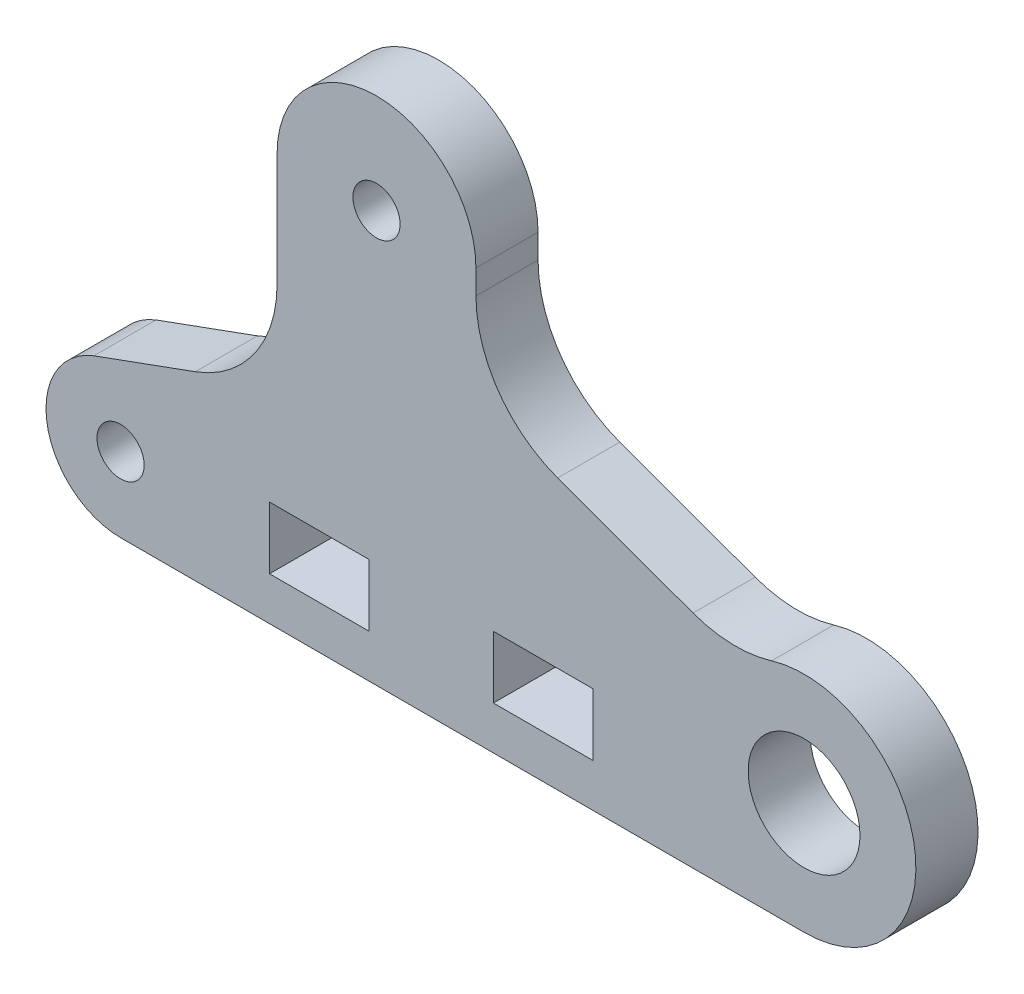
ISO-10303-21;
HEADER;
FILE_DESCRIPTION(('STEP AP214'),'2;1');
FILE_NAME('part.step','',(''),(''),'','','');
FILE_SCHEMA(('AUTOMOTIVE_DESIGN { 1 0 10303 214 1 1 1 1 }'));
ENDSEC;
DATA;
#1=APPLICATION_CONTEXT('core data for automotive mechanical design processes');
#2=APPLICATION_PROTOCOL_DEFINITION('international standard','automotive_design',2000,#1);
#3=PRODUCT_CONTEXT('',#1,'mechanical');
#4=PRODUCT('Part','Part','',(#3));
#5=PRODUCT_RELATED_PRODUCT_CATEGORY('part','',(#4));
#6=PRODUCT_DEFINITION_FORMATION('','',#4);
#7=PRODUCT_DEFINITION_CONTEXT('part definition',#1,'design');
#8=PRODUCT_DEFINITION('design','',#6,#7);
#9=PRODUCT_DEFINITION_SHAPE('','',#8);
#10=(LENGTH_UNIT() NAMED_UNIT(*) SI_UNIT(.MILLI.,.METRE.));
#11=(NAMED_UNIT(*) PLANE_ANGLE_UNIT() SI_UNIT($,.RADIAN.));
#12=(NAMED_UNIT(*) SI_UNIT($,.STERADIAN.) SOLID_ANGLE_UNIT());
#13=UNCERTAINTY_MEASURE_WITH_UNIT(LENGTH_MEASURE(1.E-05),#10,'distance_accuracy_value','');
#14=(GEOMETRIC_REPRESENTATION_CONTEXT(3) GLOBAL_UNCERTAINTY_ASSIGNED_CONTEXT((#13)) GLOBAL_UNIT_ASSIGNED_CONTEXT((#10,
#11,#12)) REPRESENTATION_CONTEXT('',''));
#15=CARTESIAN_POINT('',(0.,0.,0.));
#16=DIRECTION('',(0.,0.,1.));
#17=DIRECTION('',(1.,0.,0.));
#18=AXIS2_PLACEMENT_3D('',#15,#16,#17);
#19=CARTESIAN_POINT('',(-26.4043871462343,3.42677758397469,5.));
#20=DIRECTION('',(0.,0.,1.));
#21=DIRECTION('',(1.,0.,0.));
#22=AXIS2_PLACEMENT_3D('',#19,#20,#21);
#23=PLANE('',#22);
#24=CARTESIAN_POINT('',(-28.9999999999999,-14.5447928570877,5.));
#25=DIRECTION('',(0.,0.,1.));
#26=DIRECTION('',(1.,0.,0.));
#27=AXIS2_PLACEMENT_3D('',#24,#25,#26);
#28=CIRCLE('',#27,1.90000000000001);
#29=CARTESIAN_POINT('',(-27.0999999999999,-14.5447928570877,5.));
#30=VERTEX_POINT('',#29);
#31=EDGE_CURVE('E236',#30,#30,#28,.T.);
#32=ORIENTED_EDGE('',*,*,#31,.F.);
#33=EDGE_LOOP('',(#32));
#34=FACE_BOUND('',#33,.T.);
#35=CARTESIAN_POINT('',(-26.4043871462343,3.42677758397469,5.));
#36=DIRECTION('',(0.,0.,-1.));
#37=DIRECTION('',(1.,0.,0.));
#38=AXIS2_PLACEMENT_3D('',#35,#36,#37);
#39=CIRCLE('',#38,10.);
#40=CARTESIAN_POINT('',(-16.4043871462343,3.4267775839747,5.));
#41=VERTEX_POINT('',#40);
#42=CARTESIAN_POINT('',(-22.9841848611831,-5.97014831385656,5.));
#43=VERTEX_POINT('',#42);
#44=EDGE_CURVE('E248',#41,#43,#39,.T.);
#45=ORIENTED_EDGE('',*,*,#44,.T.);
#46=DIRECTION('',(-0.939659792499098,-0.342110324837693,0.));
#47=VECTOR('',#46,1.);
#48=CARTESIAN_POINT('',(-22.9841848611831,-5.97014831385656,5.));
#49=LINE('',#48,#47);
#50=CARTESIAN_POINT('',(-31.1458015519959,-8.94162092509676,5.));
#51=VERTEX_POINT('',#50);
#52=EDGE_CURVE('E251',#43,#51,#49,.T.);
#53=ORIENTED_EDGE('',*,*,#52,.T.);
#54=CARTESIAN_POINT('',(-28.9999999999999,-14.5447928570877,5.));
#55=DIRECTION('',(0.,0.,1.));
#56=DIRECTION('',(1.,0.,0.));
#57=AXIS2_PLACEMENT_3D('',#54,#55,#56);
#58=CIRCLE('',#57,6.00000000000003);
#59=CARTESIAN_POINT('',(-28.9999999999999,-20.5447928570877,5.));
#60=VERTEX_POINT('',#59);
#61=EDGE_CURVE('E254',#51,#60,#58,.T.);
#62=ORIENTED_EDGE('',*,*,#61,.T.);
#63=DIRECTION('',(1.,0.,0.));
#64=VECTOR('',#63,1.);
#65=CARTESIAN_POINT('',(-28.9999999999999,-20.5447928570878,5.));
#66=LINE('',#65,#64);
#67=CARTESIAN_POINT('',(26.,-20.5447928570878,5.));
#68=VERTEX_POINT('',#67);
#69=EDGE_CURVE('E256',#60,#68,#66,.T.);
#70=ORIENTED_EDGE('',*,*,#69,.T.);
#71=CARTESIAN_POINT('',(26.,-11.5447928570875,5.));
#72=DIRECTION('',(0.,0.,1.));
#73=DIRECTION('',(1.,0.,0.));
#74=AXIS2_PLACEMENT_3D('',#71,#72,#73);
#75=CIRCLE('',#74,9.00000000072732);
#76=CARTESIAN_POINT('',(23.3882644662946,-2.93207914333433,5.));
#77=VERTEX_POINT('',#76);
#78=EDGE_CURVE('E258',#68,#77,#75,.T.);
#79=ORIENTED_EDGE('',*,*,#78,.T.);
#80=CARTESIAN_POINT('',(20.4863360951547,6.63760276201075,5.));
#81=DIRECTION('',(0.,0.,-1.));
#82=DIRECTION('',(1.,0.,0.));
#83=AXIS2_PLACEMENT_3D('',#80,#81,#82);
#84=CIRCLE('',#83,10.0000000006543);
#85=CARTESIAN_POINT('',(17.0661345345524,-2.75932340019466,5.));
#86=VERTEX_POINT('',#85);
#87=EDGE_CURVE('E260',#77,#86,#84,.T.);
#88=ORIENTED_EDGE('',*,*,#87,.T.);
#89=DIRECTION('',(-0.939692607789412,0.342020179033247,0.));
#90=VECTOR('',#89,1.);
#91=CARTESIAN_POINT('',(17.0661345347762,-2.75932339957974,5.));
#92=LINE('',#91,#90);
#93=CARTESIAN_POINT('',(6.17541319131859,1.20457546778829,5.));
#94=VERTEX_POINT('',#93);
#95=EDGE_CURVE('E262',#86,#94,#92,.T.);
#96=ORIENTED_EDGE('',*,*,#95,.T.);
#97=CARTESIAN_POINT('',(9.59561413690513,10.6015018531449,5.));
#98=DIRECTION('',(0.,0.,-1.));
#99=DIRECTION('',(1.,0.,0.));
#100=AXIS2_PLACEMENT_3D('',#97,#98,#99);
#101=CIRCLE('',#100,10.0000002615902);
#102=CARTESIAN_POINT('',(-0.404386124685043,10.6015018531449,5.));
#103=VERTEX_POINT('',#102);
#104=EDGE_CURVE('E264',#94,#103,#101,.T.);
#105=ORIENTED_EDGE('',*,*,#104,.T.);
#106=DIRECTION('',(0.,1.,0.));
#107=VECTOR('',#106,1.);
#108=CARTESIAN_POINT('',(-0.404386386275102,10.6015018531449,5.));
#109=LINE('',#108,#107);
#110=CARTESIAN_POINT('',(-0.404386386275102,12.5454174696564,5.));
#111=VERTEX_POINT('',#110);
#112=EDGE_CURVE('E266',#103,#111,#109,.T.);
#113=ORIENTED_EDGE('',*,*,#112,.T.);
#114=CARTESIAN_POINT('',(-8.40438638627509,12.5454174696564,5.));
#115=DIRECTION('',(0.,0.,1.));
#116=DIRECTION('',(1.,0.,0.));
#117=AXIS2_PLACEMENT_3D('',#114,#115,#116);
#118=CIRCLE('',#117,8.0000003799796);
#119=CARTESIAN_POINT('',(-16.4043867662547,12.5454174696564,5.));
#120=VERTEX_POINT('',#119);
#121=EDGE_CURVE('E268',#111,#120,#118,.T.);
#122=ORIENTED_EDGE('',*,*,#121,.T.);
#123=DIRECTION('',(0.,-1.,0.));
#124=VECTOR('',#123,1.);
#125=CARTESIAN_POINT('',(-16.4043871462343,12.5454174696564,5.));
#126=LINE('',#125,#124);
#127=EDGE_CURVE('E270',#120,#41,#126,.T.);
#128=ORIENTED_EDGE('',*,*,#127,.T.);
#129=EDGE_LOOP('',(#45,#53,#62,#70,#79,#88,#96,#105,#113,#122,#128));
#130=FACE_BOUND('',#129,.T.);
#131=CARTESIAN_POINT('',(-8.40438638627509,12.5454174696564,5.));
#132=DIRECTION('',(0.,0.,1.));
#133=DIRECTION('',(1.,0.,0.));
#134=AXIS2_PLACEMENT_3D('',#131,#132,#133);
#135=CIRCLE('',#134,1.90000000000002);
#136=CARTESIAN_POINT('',(-6.50438638627507,12.5454174696564,5.));
#137=VERTEX_POINT('',#136);
#138=EDGE_CURVE('E242',#137,#137,#135,.T.);
#139=ORIENTED_EDGE('',*,*,#138,.F.);
#140=EDGE_LOOP('',(#139));
#141=FACE_BOUND('',#140,.T.);
#142=CARTESIAN_POINT('',(26.,-11.5447928570875,5.));
#143=DIRECTION('',(0.,0.,1.));
#144=DIRECTION('',(1.,0.,0.));
#145=AXIS2_PLACEMENT_3D('',#142,#143,#144);
#146=CIRCLE('',#145,4.5);
#147=CARTESIAN_POINT('',(30.5,-11.5447928570875,5.));
#148=VERTEX_POINT('',#147);
#149=EDGE_CURVE('E230',#148,#148,#146,.T.);
#150=ORIENTED_EDGE('',*,*,#149,.F.);
#151=EDGE_LOOP('',(#150));
#152=FACE_BOUND('',#151,.T.);
#153=DIRECTION('',(1.,0.,0.));
#154=VECTOR('',#153,1.);
#155=CARTESIAN_POINT('',(0.999995852421655,-17.0647928570878,5.));
#156=LINE('',#155,#154);
#157=CARTESIAN_POINT('',(0.999995852421655,-17.0647928570878,5.));
#158=VERTEX_POINT('',#157);
#159=CARTESIAN_POINT('',(8.99999585242166,-17.0647928570878,5.));
#160=VERTEX_POINT('',#159);
#161=EDGE_CURVE('E201',#158,#160,#156,.T.);
#162=ORIENTED_EDGE('',*,*,#161,.F.);
#163=DIRECTION('',(0.,-1.,0.));
#164=VECTOR('',#163,1.);
#165=CARTESIAN_POINT('',(0.999995852421655,-17.0647928570878,5.));
#166=LINE('',#165,#164);
#167=CARTESIAN_POINT('',(0.999995852421656,-12.0647928570878,5.));
#168=VERTEX_POINT('',#167);
#169=EDGE_CURVE('E199',#168,#158,#166,.T.);
#170=ORIENTED_EDGE('',*,*,#169,.F.);
#171=DIRECTION('',(-1.,0.,0.));
#172=VECTOR('',#171,1.);
#173=CARTESIAN_POINT('',(8.99999585242166,-12.0647928570878,5.));
#174=LINE('',#173,#172);
#175=CARTESIAN_POINT('',(8.99999585242165,-12.0647928570878,5.));
#176=VERTEX_POINT('',#175);
#177=EDGE_CURVE('E207',#176,#168,#174,.T.);
#178=ORIENTED_EDGE('',*,*,#177,.F.);
#179=DIRECTION('',(0.,1.,0.));
#180=VECTOR('',#179,1.);
#181=CARTESIAN_POINT('',(8.99999585242166,-17.0647928570878,5.));
#182=LINE('',#181,#180);
#183=EDGE_CURVE('E204',#160,#176,#182,.T.);
#184=ORIENTED_EDGE('',*,*,#183,.F.);
#185=EDGE_LOOP('',(#162,#170,#178,#184));
#186=FACE_BOUND('',#185,.T.);
#187=DIRECTION('',(-0.00277073646540046,-0.999996161502353,0.));
#188=VECTOR('',#187,1.);
#189=CARTESIAN_POINT('',(-17.0000041475783,-12.0647928570878,5.));
#190=LINE('',#189,#188);
#191=CARTESIAN_POINT('',(-17.0000041475783,-12.0647928570878,5.));
#192=VERTEX_POINT('',#191);
#193=CARTESIAN_POINT('',(-17.0138578830829,-17.0647928570878,5.));
#194=VERTEX_POINT('',#193);
#195=EDGE_CURVE('E171',#192,#194,#190,.T.);
#196=ORIENTED_EDGE('',*,*,#195,.F.);
#197=DIRECTION('',(-1.,0.,0.));
#198=VECTOR('',#197,1.);
#199=CARTESIAN_POINT('',(-9.00000414757835,-12.0647928570878,5.));
#200=LINE('',#199,#198);
#201=CARTESIAN_POINT('',(-9.00000414757835,-12.0647928570878,5.));
#202=VERTEX_POINT('',#201);
#203=EDGE_CURVE('E163',#202,#192,#200,.T.);
#204=ORIENTED_EDGE('',*,*,#203,.F.);
#205=DIRECTION('',(0.,1.,0.));
#206=VECTOR('',#205,1.);
#207=CARTESIAN_POINT('',(-9.00000414757835,-12.0647928570878,5.));
#208=LINE('',#207,#206);
#209=CARTESIAN_POINT('',(-9.00000414757834,-17.0647928570878,5.));
#210=VERTEX_POINT('',#209);
#211=EDGE_CURVE('E185',#210,#202,#208,.T.);
#212=ORIENTED_EDGE('',*,*,#211,.F.);
#213=DIRECTION('',(1.,0.,0.));
#214=VECTOR('',#213,1.);
#215=CARTESIAN_POINT('',(-17.0138578830829,-17.0647928570878,5.));
#216=LINE('',#215,#214);
#217=EDGE_CURVE('E183',#194,#210,#216,.T.);
#218=ORIENTED_EDGE('',*,*,#217,.F.);
#219=EDGE_LOOP('',(#196,#204,#212,#218));
#220=FACE_BOUND('',#219,.T.);
#221=ADVANCED_FACE('F32',(#34,#130,#141,#152,#186,#220),#23,.T.);
#222=CARTESIAN_POINT('',(-26.4043871462343,3.42677758397469,0.));
#223=DIRECTION('',(0.,0.,1.));
#224=DIRECTION('',(1.,0.,0.));
#225=AXIS2_PLACEMENT_3D('',#222,#223,#224);
#226=PLANE('',#225);
#227=DIRECTION('',(0.,-1.,0.));
#228=VECTOR('',#227,1.);
#229=CARTESIAN_POINT('',(0.999995852421655,-17.0647928570878,0.));
#230=LINE('',#229,#228);
#231=CARTESIAN_POINT('',(0.999995852421658,-12.0647928570878,0.));
#232=VERTEX_POINT('',#231);
#233=CARTESIAN_POINT('',(0.999995852421655,-17.0647928570878,0.));
#234=VERTEX_POINT('',#233);
#235=EDGE_CURVE('E179',#232,#234,#230,.T.);
#236=ORIENTED_EDGE('',*,*,#235,.T.);
#237=DIRECTION('',(1.,0.,0.));
#238=VECTOR('',#237,1.);
#239=CARTESIAN_POINT('',(0.999995852421655,-17.0647928570878,0.));
#240=LINE('',#239,#238);
#241=CARTESIAN_POINT('',(8.99999585242166,-17.0647928570878,0.));
#242=VERTEX_POINT('',#241);
#243=EDGE_CURVE('E212',#234,#242,#240,.T.);
#244=ORIENTED_EDGE('',*,*,#243,.T.);
#245=DIRECTION('',(0.,1.,0.));
#246=VECTOR('',#245,1.);
#247=CARTESIAN_POINT('',(8.99999585242166,-17.0647928570878,0.));
#248=LINE('',#247,#246);
#249=CARTESIAN_POINT('',(8.99999585242166,-12.0647928570878,0.));
#250=VERTEX_POINT('',#249);
#251=EDGE_CURVE('E215',#242,#250,#248,.T.);
#252=ORIENTED_EDGE('',*,*,#251,.T.);
#253=DIRECTION('',(-1.,0.,0.));
#254=VECTOR('',#253,1.);
#255=CARTESIAN_POINT('',(8.99999585242166,-12.0647928570878,0.));
#256=LINE('',#255,#254);
#257=EDGE_CURVE('E202',#250,#232,#256,.T.);
#258=ORIENTED_EDGE('',*,*,#257,.T.);
#259=EDGE_LOOP('',(#236,#244,#252,#258));
#260=FACE_BOUND('',#259,.T.);
#261=CARTESIAN_POINT('',(-26.4043871462343,3.42677758397469,0.));
#262=DIRECTION('',(0.,0.,-1.));
#263=DIRECTION('',(1.,0.,0.));
#264=AXIS2_PLACEMENT_3D('',#261,#262,#263);
#265=CIRCLE('',#264,10.);
#266=CARTESIAN_POINT('',(-16.4043871462343,3.4267775839747,0.));
#267=VERTEX_POINT('',#266);
#268=CARTESIAN_POINT('',(-22.9841848611831,-5.97014831385656,0.));
#269=VERTEX_POINT('',#268);
#270=EDGE_CURVE('E245',#267,#269,#265,.T.);
#271=ORIENTED_EDGE('',*,*,#270,.F.);
#272=DIRECTION('',(0.,-1.,0.));
#273=VECTOR('',#272,1.);
#274=CARTESIAN_POINT('',(-16.4043871462343,12.5454174696564,0.));
#275=LINE('',#274,#273);
#276=CARTESIAN_POINT('',(-16.4043867662547,12.5454174696564,0.));
#277=VERTEX_POINT('',#276);
#278=EDGE_CURVE('E252',#277,#267,#275,.T.);
#279=ORIENTED_EDGE('',*,*,#278,.F.);
#280=CARTESIAN_POINT('',(-8.40438638627509,12.5454174696564,0.));
#281=DIRECTION('',(0.,0.,1.));
#282=DIRECTION('',(1.,0.,0.));
#283=AXIS2_PLACEMENT_3D('',#280,#281,#282);
#284=CIRCLE('',#283,8.0000003799796);
#285=CARTESIAN_POINT('',(-0.404386386275102,12.5454174696564,0.));
#286=VERTEX_POINT('',#285);
#287=EDGE_CURVE('E291',#286,#277,#284,.T.);
#288=ORIENTED_EDGE('',*,*,#287,.F.);
#289=DIRECTION('',(0.,1.,0.));
#290=VECTOR('',#289,1.);
#291=CARTESIAN_POINT('',(-0.404386386275102,10.6015018531449,0.));
#292=LINE('',#291,#290);
#293=CARTESIAN_POINT('',(-0.404386124685043,10.6015018531449,0.));
#294=VERTEX_POINT('',#293);
#295=EDGE_CURVE('E289',#294,#286,#292,.T.);
#296=ORIENTED_EDGE('',*,*,#295,.F.);
#297=CARTESIAN_POINT('',(9.59561413690513,10.6015018531449,0.));
#298=DIRECTION('',(0.,0.,-1.));
#299=DIRECTION('',(1.,0.,0.));
#300=AXIS2_PLACEMENT_3D('',#297,#298,#299);
#301=CIRCLE('',#300,10.0000002615902);
#302=CARTESIAN_POINT('',(6.17541319131859,1.20457546778829,0.));
#303=VERTEX_POINT('',#302);
#304=EDGE_CURVE('E287',#303,#294,#301,.T.);
#305=ORIENTED_EDGE('',*,*,#304,.F.);
#306=DIRECTION('',(-0.939692607789412,0.342020179033247,0.));
#307=VECTOR('',#306,1.);
#308=CARTESIAN_POINT('',(17.0661345347762,-2.75932339957974,0.));
#309=LINE('',#308,#307);
#310=CARTESIAN_POINT('',(17.0661345345524,-2.75932340019466,0.));
#311=VERTEX_POINT('',#310);
#312=EDGE_CURVE('E285',#311,#303,#309,.T.);
#313=ORIENTED_EDGE('',*,*,#312,.F.);
#314=CARTESIAN_POINT('',(20.4863360951547,6.63760276201075,0.));
#315=DIRECTION('',(0.,0.,-1.));
#316=DIRECTION('',(1.,0.,0.));
#317=AXIS2_PLACEMENT_3D('',#314,#315,#316);
#318=CIRCLE('',#317,10.0000000006543);
#319=CARTESIAN_POINT('',(23.3882644662946,-2.93207914333433,0.));
#320=VERTEX_POINT('',#319);
#321=EDGE_CURVE('E283',#320,#311,#318,.T.);
#322=ORIENTED_EDGE('',*,*,#321,.F.);
#323=CARTESIAN_POINT('',(26.,-11.5447928570875,0.));
#324=DIRECTION('',(0.,0.,1.));
#325=DIRECTION('',(1.,0.,0.));
#326=AXIS2_PLACEMENT_3D('',#323,#324,#325);
#327=CIRCLE('',#326,9.00000000072732);
#328=CARTESIAN_POINT('',(26.,-20.5447928570878,0.));
#329=VERTEX_POINT('',#328);
#330=EDGE_CURVE('E281',#329,#320,#327,.T.);
#331=ORIENTED_EDGE('',*,*,#330,.F.);
#332=DIRECTION('',(1.,0.,0.));
#333=VECTOR('',#332,1.);
#334=CARTESIAN_POINT('',(-28.9999999999999,-20.5447928570878,0.));
#335=LINE('',#334,#333);
#336=CARTESIAN_POINT('',(-28.9999999999999,-20.5447928570877,0.));
#337=VERTEX_POINT('',#336);
#338=EDGE_CURVE('E279',#337,#329,#335,.T.);
#339=ORIENTED_EDGE('',*,*,#338,.F.);
#340=CARTESIAN_POINT('',(-28.9999999999999,-14.5447928570877,0.));
#341=DIRECTION('',(0.,0.,1.));
#342=DIRECTION('',(1.,0.,0.));
#343=AXIS2_PLACEMENT_3D('',#340,#341,#342);
#344=CIRCLE('',#343,6.00000000000003);
#345=CARTESIAN_POINT('',(-31.1458015519959,-8.94162092509676,0.));
#346=VERTEX_POINT('',#345);
#347=EDGE_CURVE('E277',#346,#337,#344,.T.);
#348=ORIENTED_EDGE('',*,*,#347,.F.);
#349=DIRECTION('',(-0.939659792499098,-0.342110324837693,0.));
#350=VECTOR('',#349,1.);
#351=CARTESIAN_POINT('',(-22.9841848611831,-5.97014831385656,0.));
#352=LINE('',#351,#350);
#353=EDGE_CURVE('E275',#269,#346,#352,.T.);
#354=ORIENTED_EDGE('',*,*,#353,.F.);
#355=EDGE_LOOP('',(#271,#279,#288,#296,#305,#313,#322,#331,#339,#348,#354));
#356=FACE_BOUND('',#355,.T.);
#357=CARTESIAN_POINT('',(-8.40438638627509,12.5454174696564,0.));
#358=DIRECTION('',(0.,0.,1.));
#359=DIRECTION('',(1.,0.,0.));
#360=AXIS2_PLACEMENT_3D('',#357,#358,#359);
#361=CIRCLE('',#360,1.90000000000002);
#362=CARTESIAN_POINT('',(-6.50438638627507,12.5454174696564,0.));
#363=VERTEX_POINT('',#362);
#364=EDGE_CURVE('E239',#363,#363,#361,.T.);
#365=ORIENTED_EDGE('',*,*,#364,.T.);
#366=EDGE_LOOP('',(#365));
#367=FACE_BOUND('',#366,.T.);
#368=CARTESIAN_POINT('',(-28.9999999999999,-14.5447928570877,0.));
#369=DIRECTION('',(0.,0.,1.));
#370=DIRECTION('',(1.,0.,0.));
#371=AXIS2_PLACEMENT_3D('',#368,#369,#370);
#372=CIRCLE('',#371,1.90000000000001);
#373=CARTESIAN_POINT('',(-27.0999999999999,-14.5447928570877,0.));
#374=VERTEX_POINT('',#373);
#375=EDGE_CURVE('E233',#374,#374,#372,.T.);
#376=ORIENTED_EDGE('',*,*,#375,.T.);
#377=EDGE_LOOP('',(#376));
#378=FACE_BOUND('',#377,.T.);
#379=CARTESIAN_POINT('',(26.,-11.5447928570875,0.));
#380=DIRECTION('',(0.,0.,1.));
#381=DIRECTION('',(1.,0.,0.));
#382=AXIS2_PLACEMENT_3D('',#379,#380,#381);
#383=CIRCLE('',#382,4.5);
#384=CARTESIAN_POINT('',(30.5,-11.5447928570875,0.));
#385=VERTEX_POINT('',#384);
#386=EDGE_CURVE('E229',#385,#385,#383,.T.);
#387=ORIENTED_EDGE('',*,*,#386,.T.);
#388=EDGE_LOOP('',(#387));
#389=FACE_BOUND('',#388,.T.);
#390=DIRECTION('',(-1.,0.,0.));
#391=VECTOR('',#390,1.);
#392=CARTESIAN_POINT('',(-9.00000414757835,-12.0647928570878,0.));
#393=LINE('',#392,#391);
#394=CARTESIAN_POINT('',(-9.00000414757835,-12.0647928570878,0.));
#395=VERTEX_POINT('',#394);
#396=CARTESIAN_POINT('',(-17.0000041475783,-12.0647928570878,0.));
#397=VERTEX_POINT('',#396);
#398=EDGE_CURVE('E55',#395,#397,#393,.T.);
#399=ORIENTED_EDGE('',*,*,#398,.T.);
#400=DIRECTION('',(-0.00277073646540046,-0.999996161502353,0.));
#401=VECTOR('',#400,1.);
#402=CARTESIAN_POINT('',(-17.0000041475783,-12.0647928570878,0.));
#403=LINE('',#402,#401);
#404=CARTESIAN_POINT('',(-17.0138578830829,-17.0647928570878,0.));
#405=VERTEX_POINT('',#404);
#406=EDGE_CURVE('E178',#397,#405,#403,.T.);
#407=ORIENTED_EDGE('',*,*,#406,.T.);
#408=DIRECTION('',(1.,0.,0.));
#409=VECTOR('',#408,1.);
#410=CARTESIAN_POINT('',(-17.0138578830829,-17.0647928570878,0.));
#411=LINE('',#410,#409);
#412=CARTESIAN_POINT('',(-9.00000414757834,-17.0647928570878,0.));
#413=VERTEX_POINT('',#412);
#414=EDGE_CURVE('E191',#405,#413,#411,.T.);
#415=ORIENTED_EDGE('',*,*,#414,.T.);
#416=DIRECTION('',(0.,1.,0.));
#417=VECTOR('',#416,1.);
#418=CARTESIAN_POINT('',(-9.00000414757835,-12.0647928570878,0.));
#419=LINE('',#418,#417);
#420=EDGE_CURVE('E172',#413,#395,#419,.T.);
#421=ORIENTED_EDGE('',*,*,#420,.T.);
#422=EDGE_LOOP('',(#399,#407,#415,#421));
#423=FACE_BOUND('',#422,.T.);
#424=ADVANCED_FACE('F330',(#260,#356,#367,#378,#389,#423),#226,.F.);
#425=CARTESIAN_POINT('',(-26.4043871462343,3.42677758397469,5.));
#426=DIRECTION('',(0.,0.,-1.));
#427=DIRECTION('',(-1.,0.,0.));
#428=AXIS2_PLACEMENT_3D('',#425,#426,#427);
#429=CYLINDRICAL_SURFACE('',#428,10.);
#430=ORIENTED_EDGE('',*,*,#270,.T.);
#431=DIRECTION('',(0.,0.,-1.));
#432=VECTOR('',#431,1.);
#433=CARTESIAN_POINT('',(-22.9841848611831,-5.97014831385656,5.));
#434=LINE('',#433,#432);
#435=EDGE_CURVE('E11',#43,#269,#434,.T.);
#436=ORIENTED_EDGE('',*,*,#435,.F.);
#437=ORIENTED_EDGE('',*,*,#44,.F.);
#438=DIRECTION('',(0.,0.,-1.));
#439=VECTOR('',#438,1.);
#440=CARTESIAN_POINT('',(-16.4043871462343,3.4267775839747,5.));
#441=LINE('',#440,#439);
#442=EDGE_CURVE('E272',#41,#267,#441,.T.);
#443=ORIENTED_EDGE('',*,*,#442,.T.);
#444=EDGE_LOOP('',(#430,#436,#437,#443));
#445=FACE_BOUND('',#444,.T.);
#446=ADVANCED_FACE('F34',(#445),#429,.F.);
#447=CARTESIAN_POINT('',(-22.9841848611831,-5.97014831385656,5.));
#448=DIRECTION('',(0.342110324837693,-0.939659792499098,0.));
#449=DIRECTION('',(0.939659792499098,0.342110324837693,0.));
#450=AXIS2_PLACEMENT_3D('',#447,#448,#449);
#451=PLANE('',#450);
#452=ORIENTED_EDGE('',*,*,#353,.T.);
#453=DIRECTION('',(0.,0.,-1.));
#454=VECTOR('',#453,1.);
#455=CARTESIAN_POINT('',(-31.1458015519959,-8.94162092509676,5.));
#456=LINE('',#455,#454);
#457=EDGE_CURVE('E40',#51,#346,#456,.T.);
#458=ORIENTED_EDGE('',*,*,#457,.F.);
#459=ORIENTED_EDGE('',*,*,#52,.F.);
#460=ORIENTED_EDGE('',*,*,#435,.T.);
#461=EDGE_LOOP('',(#452,#458,#459,#460));
#462=FACE_BOUND('',#461,.T.);
#463=ADVANCED_FACE('F348',(#462),#451,.F.);
#464=CARTESIAN_POINT('',(-28.9999999999999,-14.5447928570877,5.));
#465=DIRECTION('',(0.,0.,-1.));
#466=DIRECTION('',(-1.,0.,0.));
#467=AXIS2_PLACEMENT_3D('',#464,#465,#466);
#468=CYLINDRICAL_SURFACE('',#467,6.00000000000003);
#469=ORIENTED_EDGE('',*,*,#347,.T.);
#470=DIRECTION('',(0.,0.,-1.));
#471=VECTOR('',#470,1.);
#472=CARTESIAN_POINT('',(-28.9999999999999,-20.5447928570877,5.));
#473=LINE('',#472,#471);
#474=EDGE_CURVE('E317',#60,#337,#473,.T.);
#475=ORIENTED_EDGE('',*,*,#474,.F.);
#476=ORIENTED_EDGE('',*,*,#61,.F.);
#477=ORIENTED_EDGE('',*,*,#457,.T.);
#478=EDGE_LOOP('',(#469,#475,#476,#477));
#479=FACE_BOUND('',#478,.T.);
#480=ADVANCED_FACE('F324',(#479),#468,.T.);
#481=CARTESIAN_POINT('',(-28.9999999999999,-20.5447928570878,5.));
#482=DIRECTION('',(0.,1.,0.));
#483=DIRECTION('',(0.,0.,1.));
#484=AXIS2_PLACEMENT_3D('',#481,#482,#483);
#485=PLANE('',#484);
#486=ORIENTED_EDGE('',*,*,#338,.T.);
#487=DIRECTION('',(0.,0.,-1.));
#488=VECTOR('',#487,1.);
#489=CARTESIAN_POINT('',(26.,-20.5447928570878,5.));
#490=LINE('',#489,#488);
#491=EDGE_CURVE('E314',#68,#329,#490,.T.);
#492=ORIENTED_EDGE('',*,*,#491,.F.);
#493=ORIENTED_EDGE('',*,*,#69,.F.);
#494=ORIENTED_EDGE('',*,*,#474,.T.);
#495=EDGE_LOOP('',(#486,#492,#493,#494));
#496=FACE_BOUND('',#495,.T.);
#497=ADVANCED_FACE('F336',(#496),#485,.F.);
#498=CARTESIAN_POINT('',(26.,-11.5447928570875,5.));
#499=DIRECTION('',(0.,0.,-1.));
#500=DIRECTION('',(-1.,0.,0.));
#501=AXIS2_PLACEMENT_3D('',#498,#499,#500);
#502=CYLINDRICAL_SURFACE('',#501,9.00000000072732);
#503=ORIENTED_EDGE('',*,*,#330,.T.);
#504=DIRECTION('',(0.,0.,-1.));
#505=VECTOR('',#504,1.);
#506=CARTESIAN_POINT('',(23.3882644662946,-2.93207914333433,5.));
#507=LINE('',#506,#505);
#508=EDGE_CURVE('E311',#77,#320,#507,.T.);
#509=ORIENTED_EDGE('',*,*,#508,.F.);
#510=ORIENTED_EDGE('',*,*,#78,.F.);
#511=ORIENTED_EDGE('',*,*,#491,.T.);
#512=EDGE_LOOP('',(#503,#509,#510,#511));
#513=FACE_BOUND('',#512,.T.);
#514=ADVANCED_FACE('F340',(#513),#502,.T.);
#515=CARTESIAN_POINT('',(20.4863360951547,6.63760276201075,5.));
#516=DIRECTION('',(0.,0.,-1.));
#517=DIRECTION('',(-1.,0.,0.));
#518=AXIS2_PLACEMENT_3D('',#515,#516,#517);
#519=CYLINDRICAL_SURFACE('',#518,10.0000000006543);
#520=ORIENTED_EDGE('',*,*,#321,.T.);
#521=DIRECTION('',(0.,0.,-1.));
#522=VECTOR('',#521,1.);
#523=CARTESIAN_POINT('',(17.0661345345524,-2.75932340019466,5.));
#524=LINE('',#523,#522);
#525=EDGE_CURVE('E308',#86,#311,#524,.T.);
#526=ORIENTED_EDGE('',*,*,#525,.F.);
#527=ORIENTED_EDGE('',*,*,#87,.F.);
#528=ORIENTED_EDGE('',*,*,#508,.T.);
#529=EDGE_LOOP('',(#520,#526,#527,#528));
#530=FACE_BOUND('',#529,.T.);
#531=ADVANCED_FACE('F376',(#530),#519,.F.);
#532=CARTESIAN_POINT('',(17.0661345347762,-2.75932339957974,5.));
#533=DIRECTION('',(-0.342020179033247,-0.939692607789412,0.));
#534=DIRECTION('',(0.939692607789412,-0.342020179033247,0.));
#535=AXIS2_PLACEMENT_3D('',#532,#533,#534);
#536=PLANE('',#535);
#537=ORIENTED_EDGE('',*,*,#312,.T.);
#538=DIRECTION('',(0.,0.,-1.));
#539=VECTOR('',#538,1.);
#540=CARTESIAN_POINT('',(6.17541319131859,1.20457546778829,5.));
#541=LINE('',#540,#539);
#542=EDGE_CURVE('E305',#94,#303,#541,.T.);
#543=ORIENTED_EDGE('',*,*,#542,.F.);
#544=ORIENTED_EDGE('',*,*,#95,.F.);
#545=ORIENTED_EDGE('',*,*,#525,.T.);
#546=EDGE_LOOP('',(#537,#543,#544,#545));
#547=FACE_BOUND('',#546,.T.);
#548=ADVANCED_FACE('F374',(#547),#536,.F.);
#549=CARTESIAN_POINT('',(9.59561413690513,10.6015018531449,5.));
#550=DIRECTION('',(0.,0.,-1.));
#551=DIRECTION('',(-1.,0.,0.));
#552=AXIS2_PLACEMENT_3D('',#549,#550,#551);
#553=CYLINDRICAL_SURFACE('',#552,10.0000002615902);
#554=ORIENTED_EDGE('',*,*,#304,.T.);
#555=DIRECTION('',(0.,0.,-1.));
#556=VECTOR('',#555,1.);
#557=CARTESIAN_POINT('',(-0.404386124685043,10.6015018531449,5.));
#558=LINE('',#557,#556);
#559=EDGE_CURVE('E302',#103,#294,#558,.T.);
#560=ORIENTED_EDGE('',*,*,#559,.F.);
#561=ORIENTED_EDGE('',*,*,#104,.F.);
#562=ORIENTED_EDGE('',*,*,#542,.T.);
#563=EDGE_LOOP('',(#554,#560,#561,#562));
#564=FACE_BOUND('',#563,.T.);
#565=ADVANCED_FACE('F369',(#564),#553,.F.);
#566=CARTESIAN_POINT('',(-0.404386386275102,10.6015018531449,5.));
#567=DIRECTION('',(-1.,0.,0.));
#568=DIRECTION('',(0.,0.,1.));
#569=AXIS2_PLACEMENT_3D('',#566,#567,#568);
#570=PLANE('',#569);
#571=ORIENTED_EDGE('',*,*,#295,.T.);
#572=DIRECTION('',(0.,0.,-1.));
#573=VECTOR('',#572,1.);
#574=CARTESIAN_POINT('',(-0.404386386275102,12.5454174696564,5.));
#575=LINE('',#574,#573);
#576=EDGE_CURVE('E299',#111,#286,#575,.T.);
#577=ORIENTED_EDGE('',*,*,#576,.F.);
#578=ORIENTED_EDGE('',*,*,#112,.F.);
#579=ORIENTED_EDGE('',*,*,#559,.T.);
#580=EDGE_LOOP('',(#571,#577,#578,#579));
#581=FACE_BOUND('',#580,.T.);
#582=ADVANCED_FACE('F364',(#581),#570,.F.);
#583=CARTESIAN_POINT('',(-8.40438638627509,12.5454174696564,5.));
#584=DIRECTION('',(0.,0.,-1.));
#585=DIRECTION('',(-1.,0.,0.));
#586=AXIS2_PLACEMENT_3D('',#583,#584,#585);
#587=CYLINDRICAL_SURFACE('',#586,8.0000003799796);
#588=ORIENTED_EDGE('',*,*,#287,.T.);
#589=DIRECTION('',(0.,0.,-1.));
#590=VECTOR('',#589,1.);
#591=CARTESIAN_POINT('',(-16.4043867662547,12.5454174696564,5.));
#592=LINE('',#591,#590);
#593=EDGE_CURVE('E296',#120,#277,#592,.T.);
#594=ORIENTED_EDGE('',*,*,#593,.F.);
#595=ORIENTED_EDGE('',*,*,#121,.F.);
#596=ORIENTED_EDGE('',*,*,#576,.T.);
#597=EDGE_LOOP('',(#588,#594,#595,#596));
#598=FACE_BOUND('',#597,.T.);
#599=ADVANCED_FACE('F360',(#598),#587,.T.);
#600=CARTESIAN_POINT('',(-16.4043871462343,12.5454174696564,5.));
#601=DIRECTION('',(1.,0.,0.));
#602=DIRECTION('',(0.,0.,-1.));
#603=AXIS2_PLACEMENT_3D('',#600,#601,#602);
#604=PLANE('',#603);
#605=ORIENTED_EDGE('',*,*,#278,.T.);
#606=ORIENTED_EDGE('',*,*,#442,.F.);
#607=ORIENTED_EDGE('',*,*,#127,.F.);
#608=ORIENTED_EDGE('',*,*,#593,.T.);
#609=EDGE_LOOP('',(#605,#606,#607,#608));
#610=FACE_BOUND('',#609,.T.);
#611=ADVANCED_FACE('F355',(#610),#604,.F.);
#612=CARTESIAN_POINT('',(-8.40438638627509,12.5454174696564,5.));
#613=DIRECTION('',(0.,0.,-1.));
#614=DIRECTION('',(-1.,0.,0.));
#615=AXIS2_PLACEMENT_3D('',#612,#613,#614);
#616=CYLINDRICAL_SURFACE('',#615,1.90000000000002);
#617=ORIENTED_EDGE('',*,*,#138,.T.);
#618=EDGE_LOOP('',(#617));
#619=FACE_BOUND('',#618,.T.);
#620=ORIENTED_EDGE('',*,*,#364,.F.);
#621=EDGE_LOOP('',(#620));
#622=FACE_BOUND('',#621,.T.);
#623=ADVANCED_FACE('F395',(#619,#622),#616,.F.);
#624=CARTESIAN_POINT('',(-28.9999999999999,-14.5447928570877,5.));
#625=DIRECTION('',(0.,0.,-1.));
#626=DIRECTION('',(-1.,0.,0.));
#627=AXIS2_PLACEMENT_3D('',#624,#625,#626);
#628=CYLINDRICAL_SURFACE('',#627,1.90000000000001);
#629=ORIENTED_EDGE('',*,*,#31,.T.);
#630=EDGE_LOOP('',(#629));
#631=FACE_BOUND('',#630,.T.);
#632=ORIENTED_EDGE('',*,*,#375,.F.);
#633=EDGE_LOOP('',(#632));
#634=FACE_BOUND('',#633,.T.);
#635=ADVANCED_FACE('F427',(#631,#634),#628,.F.);
#636=CARTESIAN_POINT('',(26.,-11.5447928570875,5.));
#637=DIRECTION('',(0.,0.,-1.));
#638=DIRECTION('',(-1.,0.,0.));
#639=AXIS2_PLACEMENT_3D('',#636,#637,#638);
#640=CYLINDRICAL_SURFACE('',#639,4.5);
#641=ORIENTED_EDGE('',*,*,#149,.T.);
#642=EDGE_LOOP('',(#641));
#643=FACE_BOUND('',#642,.T.);
#644=ORIENTED_EDGE('',*,*,#386,.F.);
#645=EDGE_LOOP('',(#644));
#646=FACE_BOUND('',#645,.T.);
#647=ADVANCED_FACE('F434',(#643,#646),#640,.F.);
#648=CARTESIAN_POINT('',(0.999995852421655,-17.0647928570878,5.));
#649=DIRECTION('',(1.,0.,0.));
#650=DIRECTION('',(0.,1.,0.));
#651=AXIS2_PLACEMENT_3D('',#648,#649,#650);
#652=PLANE('',#651);
#653=ORIENTED_EDGE('',*,*,#235,.F.);
#654=DIRECTION('',(0.,0.,-1.));
#655=VECTOR('',#654,1.);
#656=CARTESIAN_POINT('',(0.999995852421656,-12.0647928570878,5.));
#657=LINE('',#656,#655);
#658=EDGE_CURVE('E209',#168,#232,#657,.T.);
#659=ORIENTED_EDGE('',*,*,#658,.F.);
#660=ORIENTED_EDGE('',*,*,#169,.T.);
#661=DIRECTION('',(0.,0.,-1.));
#662=VECTOR('',#661,1.);
#663=CARTESIAN_POINT('',(0.999995852421655,-17.0647928570878,5.));
#664=LINE('',#663,#662);
#665=EDGE_CURVE('E226',#158,#234,#664,.T.);
#666=ORIENTED_EDGE('',*,*,#665,.T.);
#667=EDGE_LOOP('',(#653,#659,#660,#666));
#668=FACE_BOUND('',#667,.T.);
#669=ADVANCED_FACE('F441',(#668),#652,.T.);
#670=CARTESIAN_POINT('',(0.999995852421655,-17.0647928570878,5.));
#671=DIRECTION('',(0.,1.,0.));
#672=DIRECTION('',(0.,0.,1.));
#673=AXIS2_PLACEMENT_3D('',#670,#671,#672);
#674=PLANE('',#673);
#675=ORIENTED_EDGE('',*,*,#243,.F.);
#676=ORIENTED_EDGE('',*,*,#665,.F.);
#677=ORIENTED_EDGE('',*,*,#161,.T.);
#678=DIRECTION('',(0.,0.,-1.));
#679=VECTOR('',#678,1.);
#680=CARTESIAN_POINT('',(8.99999585242166,-17.0647928570878,5.));
#681=LINE('',#680,#679);
#682=EDGE_CURVE('E224',#160,#242,#681,.T.);
#683=ORIENTED_EDGE('',*,*,#682,.T.);
#684=EDGE_LOOP('',(#675,#676,#677,#683));
#685=FACE_BOUND('',#684,.T.);
#686=ADVANCED_FACE('F449',(#685),#674,.T.);
#687=CARTESIAN_POINT('',(8.99999585242166,-17.0647928570878,5.));
#688=DIRECTION('',(-1.,0.,0.));
#689=DIRECTION('',(0.,0.,1.));
#690=AXIS2_PLACEMENT_3D('',#687,#688,#689);
#691=PLANE('',#690);
#692=ORIENTED_EDGE('',*,*,#251,.F.);
#693=ORIENTED_EDGE('',*,*,#682,.F.);
#694=ORIENTED_EDGE('',*,*,#183,.T.);
#695=DIRECTION('',(0.,0.,-1.));
#696=VECTOR('',#695,1.);
#697=CARTESIAN_POINT('',(8.99999585242166,-12.0647928570878,5.));
#698=LINE('',#697,#696);
#699=EDGE_CURVE('E222',#176,#250,#698,.T.);
#700=ORIENTED_EDGE('',*,*,#699,.T.);
#701=EDGE_LOOP('',(#692,#693,#694,#700));
#702=FACE_BOUND('',#701,.T.);
#703=ADVANCED_FACE('F457',(#702),#691,.T.);
#704=CARTESIAN_POINT('',(8.99999585242166,-12.0647928570878,5.));
#705=DIRECTION('',(0.,-1.,0.));
#706=DIRECTION('',(1.,0.,0.));
#707=AXIS2_PLACEMENT_3D('',#704,#705,#706);
#708=PLANE('',#707);
#709=ORIENTED_EDGE('',*,*,#257,.F.);
#710=ORIENTED_EDGE('',*,*,#699,.F.);
#711=ORIENTED_EDGE('',*,*,#177,.T.);
#712=ORIENTED_EDGE('',*,*,#658,.T.);
#713=EDGE_LOOP('',(#709,#710,#711,#712));
#714=FACE_BOUND('',#713,.T.);
#715=ADVANCED_FACE('F465',(#714),#708,.T.);
#716=CARTESIAN_POINT('',(-9.00000414757835,-12.0647928570878,5.));
#717=DIRECTION('',(0.,-1.,0.));
#718=DIRECTION('',(0.,0.,-1.));
#719=AXIS2_PLACEMENT_3D('',#716,#717,#718);
#720=PLANE('',#719);
#721=ORIENTED_EDGE('',*,*,#398,.F.);
#722=DIRECTION('',(0.,0.,-1.));
#723=VECTOR('',#722,1.);
#724=CARTESIAN_POINT('',(-9.00000414757835,-12.0647928570878,5.));
#725=LINE('',#724,#723);
#726=EDGE_CURVE('E167',#202,#395,#725,.T.);
#727=ORIENTED_EDGE('',*,*,#726,.F.);
#728=ORIENTED_EDGE('',*,*,#203,.T.);
#729=DIRECTION('',(0.,0.,-1.));
#730=VECTOR('',#729,1.);
#731=CARTESIAN_POINT('',(-17.0000041475783,-12.0647928570878,5.));
#732=LINE('',#731,#730);
#733=EDGE_CURVE('E166',#192,#397,#732,.T.);
#734=ORIENTED_EDGE('',*,*,#733,.T.);
#735=EDGE_LOOP('',(#721,#727,#728,#734));
#736=FACE_BOUND('',#735,.T.);
#737=ADVANCED_FACE('F165',(#736),#720,.T.);
#738=CARTESIAN_POINT('',(-17.0000041475783,-12.0647928570878,5.));
#739=DIRECTION('',(0.999996161502353,-0.00277073646540046,0.));
#740=DIRECTION('',(0.00277073646540046,0.999996161502353,0.));
#741=AXIS2_PLACEMENT_3D('',#738,#739,#740);
#742=PLANE('',#741);
#743=ORIENTED_EDGE('',*,*,#406,.F.);
#744=ORIENTED_EDGE('',*,*,#733,.F.);
#745=ORIENTED_EDGE('',*,*,#195,.T.);
#746=DIRECTION('',(0.,0.,-1.));
#747=VECTOR('',#746,1.);
#748=CARTESIAN_POINT('',(-17.0138578830829,-17.0647928570878,5.));
#749=LINE('',#748,#747);
#750=EDGE_CURVE('E180',#194,#405,#749,.T.);
#751=ORIENTED_EDGE('',*,*,#750,.T.);
#752=EDGE_LOOP('',(#743,#744,#745,#751));
#753=FACE_BOUND('',#752,.T.);
#754=ADVANCED_FACE('F175',(#753),#742,.T.);
#755=CARTESIAN_POINT('',(-17.0138578830829,-17.0647928570878,5.));
#756=DIRECTION('',(0.,1.,0.));
#757=DIRECTION('',(0.,0.,1.));
#758=AXIS2_PLACEMENT_3D('',#755,#756,#757);
#759=PLANE('',#758);
#760=ORIENTED_EDGE('',*,*,#414,.F.);
#761=ORIENTED_EDGE('',*,*,#750,.F.);
#762=ORIENTED_EDGE('',*,*,#217,.T.);
#763=DIRECTION('',(0.,0.,-1.));
#764=VECTOR('',#763,1.);
#765=CARTESIAN_POINT('',(-9.00000414757834,-17.0647928570878,5.));
#766=LINE('',#765,#764);
#767=EDGE_CURVE('E47',#210,#413,#766,.T.);
#768=ORIENTED_EDGE('',*,*,#767,.T.);
#769=EDGE_LOOP('',(#760,#761,#762,#768));
#770=FACE_BOUND('',#769,.T.);
#771=ADVANCED_FACE('F486',(#770),#759,.T.);
#772=CARTESIAN_POINT('',(-9.00000414757835,-12.0647928570878,5.));
#773=DIRECTION('',(-1.,0.,0.));
#774=DIRECTION('',(0.,-1.,0.));
#775=AXIS2_PLACEMENT_3D('',#772,#773,#774);
#776=PLANE('',#775);
#777=ORIENTED_EDGE('',*,*,#420,.F.);
#778=ORIENTED_EDGE('',*,*,#767,.F.);
#779=ORIENTED_EDGE('',*,*,#211,.T.);
#780=ORIENTED_EDGE('',*,*,#726,.T.);
#781=EDGE_LOOP('',(#777,#778,#779,#780));
#782=FACE_BOUND('',#781,.T.);
#783=ADVANCED_FACE('F493',(#782),#776,.T.);
#784=CLOSED_SHELL('',(#221,#424,#446,#463,#480,#497,#514,#531,#548,#565,#582,#599,#611,#623,
#635,#647,#669,#686,#703,#715,#737,#754,#771,#783));
#785=MANIFOLD_SOLID_BREP('B2',#784);
#786=ADVANCED_BREP_SHAPE_REPRESENTATION('',(#18,#785),#14);
#787=SHAPE_DEFINITION_REPRESENTATION(#9,#786);
ENDSEC;
END-ISO-10303-21;
